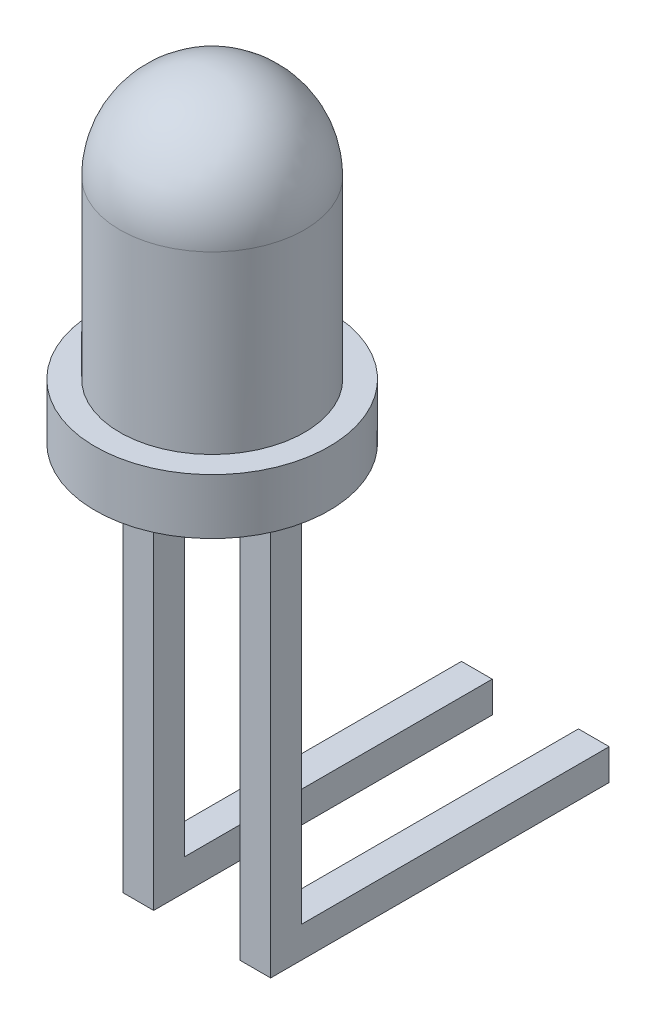
ISO-10303-21;
HEADER;
FILE_DESCRIPTION(('STEP AP214'),'2;1');
FILE_NAME('part.step','',(''),(''),'','','');
FILE_SCHEMA(('AUTOMOTIVE_DESIGN { 1 0 10303 214 1 1 1 1 }'));
ENDSEC;
DATA;
#1=APPLICATION_CONTEXT('core data for automotive mechanical design processes');
#2=APPLICATION_PROTOCOL_DEFINITION('international standard','automotive_design',2000,#1);
#3=PRODUCT_CONTEXT('',#1,'mechanical');
#4=PRODUCT('Part','Part','',(#3));
#5=PRODUCT_RELATED_PRODUCT_CATEGORY('part','',(#4));
#6=PRODUCT_DEFINITION_FORMATION('','',#4);
#7=PRODUCT_DEFINITION_CONTEXT('part definition',#1,'design');
#8=PRODUCT_DEFINITION('design','',#6,#7);
#9=PRODUCT_DEFINITION_SHAPE('','',#8);
#10=(LENGTH_UNIT() NAMED_UNIT(*) SI_UNIT(.MILLI.,.METRE.));
#11=(NAMED_UNIT(*) PLANE_ANGLE_UNIT() SI_UNIT($,.RADIAN.));
#12=(NAMED_UNIT(*) SI_UNIT($,.STERADIAN.) SOLID_ANGLE_UNIT());
#13=UNCERTAINTY_MEASURE_WITH_UNIT(LENGTH_MEASURE(1.E-05),#10,'distance_accuracy_value','');
#14=(GEOMETRIC_REPRESENTATION_CONTEXT(3) GLOBAL_UNCERTAINTY_ASSIGNED_CONTEXT((#13)) GLOBAL_UNIT_ASSIGNED_CONTEXT((#10,
#11,#12)) REPRESENTATION_CONTEXT('',''));
#15=CARTESIAN_POINT('',(0.,0.,0.));
#16=DIRECTION('',(0.,0.,1.));
#17=DIRECTION('',(1.,0.,0.));
#18=AXIS2_PLACEMENT_3D('',#15,#16,#17);
#19=CARTESIAN_POINT('',(0.,0.,-0.25));
#20=DIRECTION('',(0.,0.,-1.));
#21=DIRECTION('',(-1.,0.,0.));
#22=AXIS2_PLACEMENT_3D('',#19,#20,#21);
#23=PLANE('',#22);
#24=DIRECTION('',(0.,1.,0.));
#25=VECTOR('',#24,1.);
#26=CARTESIAN_POINT('',(1.2,2.31652278103782,-0.25));
#27=LINE('',#26,#25);
#28=CARTESIAN_POINT('',(1.2,-3.97867943829056,-0.25));
#29=VERTEX_POINT('',#28);
#30=CARTESIAN_POINT('',(1.2,2.31652278103782,-0.25));
#31=VERTEX_POINT('',#30);
#32=EDGE_CURVE('E171',#29,#31,#27,.T.);
#33=ORIENTED_EDGE('',*,*,#32,.F.);
#34=DIRECTION('',(1.,0.,0.));
#35=VECTOR('',#34,1.);
#36=CARTESIAN_POINT('',(0.700000000000002,-3.97867943829056,-0.25));
#37=LINE('',#36,#35);
#38=CARTESIAN_POINT('',(0.700000000000002,-3.97867943829056,-0.25));
#39=VERTEX_POINT('',#38);
#40=EDGE_CURVE('E143',#39,#29,#37,.T.);
#41=ORIENTED_EDGE('',*,*,#40,.F.);
#42=DIRECTION('',(0.,-1.,0.));
#43=VECTOR('',#42,1.);
#44=CARTESIAN_POINT('',(0.700000000000002,-4.48347721896218,-0.25));
#45=LINE('',#44,#43);
#46=CARTESIAN_POINT('',(0.700000000000001,2.31652278103782,-0.25));
#47=VERTEX_POINT('',#46);
#48=EDGE_CURVE('E148',#47,#39,#45,.T.);
#49=ORIENTED_EDGE('',*,*,#48,.F.);
#50=DIRECTION('',(-1.,0.,0.));
#51=VECTOR('',#50,1.);
#52=CARTESIAN_POINT('',(0.700000000000001,2.31652278103782,-0.25));
#53=LINE('',#52,#51);
#54=EDGE_CURVE('E181',#31,#47,#53,.T.);
#55=ORIENTED_EDGE('',*,*,#54,.F.);
#56=EDGE_LOOP('',(#33,#41,#49,#55));
#57=FACE_BOUND('',#56,.T.);
#58=ADVANCED_FACE('F35',(#57),#23,.T.);
#59=CARTESIAN_POINT('',(0.,0.,-0.25));
#60=DIRECTION('',(0.,0.,-1.));
#61=DIRECTION('',(-1.,0.,0.));
#62=AXIS2_PLACEMENT_3D('',#59,#60,#61);
#63=PLANE('',#62);
#64=DIRECTION('',(0.,1.,0.));
#65=VECTOR('',#64,1.);
#66=CARTESIAN_POINT('',(-0.699999999999999,2.31652278103782,-0.25));
#67=LINE('',#66,#65);
#68=CARTESIAN_POINT('',(-0.699999999999999,-3.97867943829056,-0.25));
#69=VERTEX_POINT('',#68);
#70=CARTESIAN_POINT('',(-0.699999999999999,2.31652278103782,-0.25));
#71=VERTEX_POINT('',#70);
#72=EDGE_CURVE('E195',#69,#71,#67,.T.);
#73=ORIENTED_EDGE('',*,*,#72,.F.);
#74=DIRECTION('',(1.,0.,0.));
#75=VECTOR('',#74,1.);
#76=CARTESIAN_POINT('',(-1.2,-3.97867943829056,-0.25));
#77=LINE('',#76,#75);
#78=CARTESIAN_POINT('',(-1.2,-3.97867943829056,-0.25));
#79=VERTEX_POINT('',#78);
#80=EDGE_CURVE('E149',#79,#69,#77,.T.);
#81=ORIENTED_EDGE('',*,*,#80,.F.);
#82=DIRECTION('',(0.,-1.,0.));
#83=VECTOR('',#82,1.);
#84=CARTESIAN_POINT('',(-1.2,-4.48347721896218,-0.25));
#85=LINE('',#84,#83);
#86=CARTESIAN_POINT('',(-1.2,2.31652278103782,-0.25));
#87=VERTEX_POINT('',#86);
#88=EDGE_CURVE('E204',#87,#79,#85,.T.);
#89=ORIENTED_EDGE('',*,*,#88,.F.);
#90=DIRECTION('',(-1.,0.,0.));
#91=VECTOR('',#90,1.);
#92=CARTESIAN_POINT('',(-0.699999999999999,2.31652278103782,-0.25));
#93=LINE('',#92,#91);
#94=EDGE_CURVE('E190',#71,#87,#93,.T.);
#95=ORIENTED_EDGE('',*,*,#94,.F.);
#96=EDGE_LOOP('',(#73,#81,#89,#95));
#97=FACE_BOUND('',#96,.T.);
#98=ADVANCED_FACE('F231',(#97),#63,.T.);
#99=CARTESIAN_POINT('',(-1.9,2.31652278103782,0.));
#100=DIRECTION('',(0.,-1.,0.));
#101=DIRECTION('',(1.,0.,0.));
#102=AXIS2_PLACEMENT_3D('',#99,#100,#101);
#103=PLANE('',#102);
#104=CARTESIAN_POINT('',(0.,2.31652278103782,0.));
#105=DIRECTION('',(0.,1.,0.));
#106=DIRECTION('',(-1.,0.,0.));
#107=AXIS2_PLACEMENT_3D('',#104,#105,#106);
#108=CIRCLE('',#107,1.9);
#109=CARTESIAN_POINT('',(-1.9,2.31652278103782,0.));
#110=VERTEX_POINT('',#109);
#111=EDGE_CURVE('E43',#110,#110,#108,.T.);
#112=ORIENTED_EDGE('',*,*,#111,.F.);
#113=EDGE_LOOP('',(#112));
#114=FACE_BOUND('',#113,.T.);
#115=DIRECTION('',(0.,0.,-1.));
#116=VECTOR('',#115,1.);
#117=CARTESIAN_POINT('',(-1.2,2.31652278103782,0.25));
#118=LINE('',#117,#116);
#119=CARTESIAN_POINT('',(-1.2,2.31652278103782,0.25));
#120=VERTEX_POINT('',#119);
#121=EDGE_CURVE('E214',#120,#87,#118,.T.);
#122=ORIENTED_EDGE('',*,*,#121,.F.);
#123=DIRECTION('',(-1.,0.,0.));
#124=VECTOR('',#123,1.);
#125=CARTESIAN_POINT('',(-0.699999999999999,2.31652278103782,0.25));
#126=LINE('',#125,#124);
#127=CARTESIAN_POINT('',(-0.699999999999999,2.31652278103782,0.25));
#128=VERTEX_POINT('',#127);
#129=EDGE_CURVE('E191',#128,#120,#126,.T.);
#130=ORIENTED_EDGE('',*,*,#129,.F.);
#131=DIRECTION('',(0.,0.,-1.));
#132=VECTOR('',#131,1.);
#133=CARTESIAN_POINT('',(-0.699999999999999,2.31652278103782,0.25));
#134=LINE('',#133,#132);
#135=EDGE_CURVE('E202',#128,#71,#134,.T.);
#136=ORIENTED_EDGE('',*,*,#135,.T.);
#137=ORIENTED_EDGE('',*,*,#94,.T.);
#138=EDGE_LOOP('',(#122,#130,#136,#137));
#139=FACE_BOUND('',#138,.T.);
#140=DIRECTION('',(0.,0.,-1.));
#141=VECTOR('',#140,1.);
#142=CARTESIAN_POINT('',(0.700000000000001,2.31652278103782,0.25));
#143=LINE('',#142,#141);
#144=CARTESIAN_POINT('',(0.700000000000001,2.31652278103782,0.25));
#145=VERTEX_POINT('',#144);
#146=EDGE_CURVE('E55',#145,#47,#143,.T.);
#147=ORIENTED_EDGE('',*,*,#146,.F.);
#148=DIRECTION('',(-1.,0.,0.));
#149=VECTOR('',#148,1.);
#150=CARTESIAN_POINT('',(0.700000000000001,2.31652278103782,0.25));
#151=LINE('',#150,#149);
#152=CARTESIAN_POINT('',(1.2,2.31652278103782,0.25));
#153=VERTEX_POINT('',#152);
#154=EDGE_CURVE('E50',#153,#145,#151,.T.);
#155=ORIENTED_EDGE('',*,*,#154,.F.);
#156=DIRECTION('',(0.,0.,-1.));
#157=VECTOR('',#156,1.);
#158=CARTESIAN_POINT('',(1.2,2.31652278103782,0.25));
#159=LINE('',#158,#157);
#160=EDGE_CURVE('E188',#153,#31,#159,.T.);
#161=ORIENTED_EDGE('',*,*,#160,.T.);
#162=ORIENTED_EDGE('',*,*,#54,.T.);
#163=EDGE_LOOP('',(#147,#155,#161,#162));
#164=FACE_BOUND('',#163,.T.);
#165=ADVANCED_FACE('F228',(#114,#139,#164),#103,.T.);
#166=CARTESIAN_POINT('',(-1.5,3.21652278103782,0.));
#167=DIRECTION('',(0.,1.,0.));
#168=DIRECTION('',(-1.,0.,0.));
#169=AXIS2_PLACEMENT_3D('',#166,#167,#168);
#170=PLANE('',#169);
#171=CARTESIAN_POINT('',(0.,3.21652278103782,0.));
#172=DIRECTION('',(0.,1.,0.));
#173=DIRECTION('',(-1.,0.,0.));
#174=AXIS2_PLACEMENT_3D('',#171,#172,#173);
#175=CIRCLE('',#174,1.9);
#176=CARTESIAN_POINT('',(-1.9,3.21652278103782,0.));
#177=VERTEX_POINT('',#176);
#178=EDGE_CURVE('E11',#177,#177,#175,.T.);
#179=ORIENTED_EDGE('',*,*,#178,.T.);
#180=EDGE_LOOP('',(#179));
#181=FACE_BOUND('',#180,.T.);
#182=CARTESIAN_POINT('',(0.,3.21652278103782,0.));
#183=DIRECTION('',(0.,1.,0.));
#184=DIRECTION('',(-1.,0.,0.));
#185=AXIS2_PLACEMENT_3D('',#182,#183,#184);
#186=CIRCLE('',#185,1.5);
#187=CARTESIAN_POINT('',(-1.5,3.21652278103782,0.));
#188=VERTEX_POINT('',#187);
#189=EDGE_CURVE('E217',#188,#188,#186,.T.);
#190=ORIENTED_EDGE('',*,*,#189,.F.);
#191=EDGE_LOOP('',(#190));
#192=FACE_BOUND('',#191,.T.);
#193=ADVANCED_FACE('F37',(#181,#192),#170,.T.);
#194=CARTESIAN_POINT('',(0.,7.56652278103782,0.));
#195=DIRECTION('',(0.,1.,0.));
#196=DIRECTION('',(-1.,0.,0.));
#197=AXIS2_PLACEMENT_3D('',#194,#195,#196);
#198=CYLINDRICAL_SURFACE('',#197,1.9);
#199=ORIENTED_EDGE('',*,*,#111,.T.);
#200=EDGE_LOOP('',(#199));
#201=FACE_BOUND('',#200,.T.);
#202=ORIENTED_EDGE('',*,*,#178,.F.);
#203=EDGE_LOOP('',(#202));
#204=FACE_BOUND('',#203,.T.);
#205=ADVANCED_FACE('F225',(#201,#204),#198,.T.);
#206=CARTESIAN_POINT('',(0.,6.06652278103782,0.));
#207=DIRECTION('',(0.,1.,0.));
#208=DIRECTION('',(1.,0.,0.));
#209=AXIS2_PLACEMENT_3D('',#206,#207,#208);
#210=SPHERICAL_SURFACE('',#209,1.5);
#211=CARTESIAN_POINT('',(0.,6.06652278103782,0.));
#212=DIRECTION('',(0.,1.,0.));
#213=DIRECTION('',(-1.,0.,0.));
#214=AXIS2_PLACEMENT_3D('',#211,#212,#213);
#215=CIRCLE('',#214,1.5);
#216=CARTESIAN_POINT('',(-1.5,6.06652278103782,0.));
#217=VERTEX_POINT('',#216);
#218=EDGE_CURVE('E220',#217,#217,#215,.T.);
#219=ORIENTED_EDGE('',*,*,#218,.T.);
#220=EDGE_LOOP('',(#219));
#221=FACE_BOUND('',#220,.T.);
#222=ADVANCED_FACE('F412',(#221),#210,.T.);
#223=CARTESIAN_POINT('',(0.,7.56652278103782,0.));
#224=DIRECTION('',(0.,1.,0.));
#225=DIRECTION('',(-1.,0.,0.));
#226=AXIS2_PLACEMENT_3D('',#223,#224,#225);
#227=CYLINDRICAL_SURFACE('',#226,1.5);
#228=ORIENTED_EDGE('',*,*,#189,.T.);
#229=EDGE_LOOP('',(#228));
#230=FACE_BOUND('',#229,.T.);
#231=ORIENTED_EDGE('',*,*,#218,.F.);
#232=EDGE_LOOP('',(#231));
#233=FACE_BOUND('',#232,.T.);
#234=ADVANCED_FACE('F268',(#230,#233),#227,.T.);
#235=CARTESIAN_POINT('',(-1.2,-4.48347721896218,0.25));
#236=DIRECTION('',(1.,0.,0.));
#237=DIRECTION('',(0.,0.,-1.));
#238=AXIS2_PLACEMENT_3D('',#235,#236,#237);
#239=PLANE('',#238);
#240=ORIENTED_EDGE('',*,*,#88,.T.);
#241=DIRECTION('',(0.,0.,1.));
#242=VECTOR('',#241,1.);
#243=CARTESIAN_POINT('',(-1.2,-3.97867943829056,-5.25));
#244=LINE('',#243,#242);
#245=CARTESIAN_POINT('',(-1.2,-3.97867943829056,-5.25));
#246=VERTEX_POINT('',#245);
#247=EDGE_CURVE('E169',#246,#79,#244,.T.);
#248=ORIENTED_EDGE('',*,*,#247,.F.);
#249=DIRECTION('',(0.,1.,0.));
#250=VECTOR('',#249,1.);
#251=CARTESIAN_POINT('',(-1.2,-4.48347721896218,-5.25));
#252=LINE('',#251,#250);
#253=CARTESIAN_POINT('',(-1.2,-4.48347721896218,-5.25));
#254=VERTEX_POINT('',#253);
#255=EDGE_CURVE('E151',#254,#246,#252,.T.);
#256=ORIENTED_EDGE('',*,*,#255,.F.);
#257=DIRECTION('',(0.,0.,-1.));
#258=VECTOR('',#257,1.);
#259=CARTESIAN_POINT('',(-1.2,-4.48347721896218,0.25));
#260=LINE('',#259,#258);
#261=CARTESIAN_POINT('',(-1.2,-4.48347721896218,0.25));
#262=VERTEX_POINT('',#261);
#263=EDGE_CURVE('E212',#262,#254,#260,.T.);
#264=ORIENTED_EDGE('',*,*,#263,.F.);
#265=DIRECTION('',(0.,-1.,0.));
#266=VECTOR('',#265,1.);
#267=CARTESIAN_POINT('',(-1.2,-4.48347721896218,0.25));
#268=LINE('',#267,#266);
#269=EDGE_CURVE('E194',#120,#262,#268,.T.);
#270=ORIENTED_EDGE('',*,*,#269,.F.);
#271=ORIENTED_EDGE('',*,*,#121,.T.);
#272=EDGE_LOOP('',(#240,#248,#256,#264,#270,#271));
#273=FACE_BOUND('',#272,.T.);
#274=ADVANCED_FACE('F238',(#273),#239,.F.);
#275=CARTESIAN_POINT('',(-0.699999999999998,-4.48347721896218,0.25));
#276=DIRECTION('',(0.,1.,0.));
#277=DIRECTION('',(0.,0.,1.));
#278=AXIS2_PLACEMENT_3D('',#275,#276,#277);
#279=PLANE('',#278);
#280=ORIENTED_EDGE('',*,*,#263,.T.);
#281=DIRECTION('',(-1.,0.,0.));
#282=VECTOR('',#281,1.);
#283=CARTESIAN_POINT('',(-1.2,-4.48347721896218,-5.25));
#284=LINE('',#283,#282);
#285=CARTESIAN_POINT('',(-0.699999999999999,-4.48347721896218,-5.25));
#286=VERTEX_POINT('',#285);
#287=EDGE_CURVE('E163',#286,#254,#284,.T.);
#288=ORIENTED_EDGE('',*,*,#287,.F.);
#289=DIRECTION('',(0.,0.,-1.));
#290=VECTOR('',#289,1.);
#291=CARTESIAN_POINT('',(-0.699999999999998,-4.48347721896218,0.25));
#292=LINE('',#291,#290);
#293=CARTESIAN_POINT('',(-0.699999999999998,-4.48347721896218,0.25));
#294=VERTEX_POINT('',#293);
#295=EDGE_CURVE('E210',#294,#286,#292,.T.);
#296=ORIENTED_EDGE('',*,*,#295,.F.);
#297=DIRECTION('',(1.,0.,0.));
#298=VECTOR('',#297,1.);
#299=CARTESIAN_POINT('',(-0.699999999999998,-4.48347721896218,0.25));
#300=LINE('',#299,#298);
#301=EDGE_CURVE('E197',#262,#294,#300,.T.);
#302=ORIENTED_EDGE('',*,*,#301,.F.);
#303=EDGE_LOOP('',(#280,#288,#296,#302));
#304=FACE_BOUND('',#303,.T.);
#305=ADVANCED_FACE('F260',(#304),#279,.F.);
#306=CARTESIAN_POINT('',(-0.699999999999999,2.31652278103782,0.25));
#307=DIRECTION('',(-1.,0.,0.));
#308=DIRECTION('',(0.,-1.,0.));
#309=AXIS2_PLACEMENT_3D('',#306,#307,#308);
#310=PLANE('',#309);
#311=ORIENTED_EDGE('',*,*,#295,.T.);
#312=DIRECTION('',(0.,-1.,0.));
#313=VECTOR('',#312,1.);
#314=CARTESIAN_POINT('',(-0.699999999999999,-4.48347721896218,-5.25));
#315=LINE('',#314,#313);
#316=CARTESIAN_POINT('',(-0.699999999999999,-3.97867943829056,-5.25));
#317=VERTEX_POINT('',#316);
#318=EDGE_CURVE('E160',#317,#286,#315,.T.);
#319=ORIENTED_EDGE('',*,*,#318,.F.);
#320=DIRECTION('',(0.,0.,1.));
#321=VECTOR('',#320,1.);
#322=CARTESIAN_POINT('',(-0.699999999999999,-3.97867943829056,-5.25));
#323=LINE('',#322,#321);
#324=EDGE_CURVE('E165',#317,#69,#323,.T.);
#325=ORIENTED_EDGE('',*,*,#324,.T.);
#326=ORIENTED_EDGE('',*,*,#72,.T.);
#327=ORIENTED_EDGE('',*,*,#135,.F.);
#328=DIRECTION('',(0.,1.,0.));
#329=VECTOR('',#328,1.);
#330=CARTESIAN_POINT('',(-0.699999999999999,2.31652278103782,0.25));
#331=LINE('',#330,#329);
#332=EDGE_CURVE('E199',#294,#128,#331,.T.);
#333=ORIENTED_EDGE('',*,*,#332,.F.);
#334=EDGE_LOOP('',(#311,#319,#325,#326,#327,#333));
#335=FACE_BOUND('',#334,.T.);
#336=ADVANCED_FACE('F247',(#335),#310,.F.);
#337=CARTESIAN_POINT('',(0.,0.,0.25));
#338=DIRECTION('',(0.,0.,-1.));
#339=DIRECTION('',(-1.,0.,0.));
#340=AXIS2_PLACEMENT_3D('',#337,#338,#339);
#341=PLANE('',#340);
#342=ORIENTED_EDGE('',*,*,#129,.T.);
#343=ORIENTED_EDGE('',*,*,#269,.T.);
#344=ORIENTED_EDGE('',*,*,#301,.T.);
#345=ORIENTED_EDGE('',*,*,#332,.T.);
#346=EDGE_LOOP('',(#342,#343,#344,#345));
#347=FACE_BOUND('',#346,.T.);
#348=ADVANCED_FACE('F242',(#347),#341,.F.);
#349=CARTESIAN_POINT('',(1.2,2.31652278103782,0.25));
#350=DIRECTION('',(-1.,0.,0.));
#351=DIRECTION('',(0.,-1.,0.));
#352=AXIS2_PLACEMENT_3D('',#349,#350,#351);
#353=PLANE('',#352);
#354=DIRECTION('',(0.,0.,-1.));
#355=VECTOR('',#354,1.);
#356=CARTESIAN_POINT('',(1.2,-4.48347721896218,0.25));
#357=LINE('',#356,#355);
#358=CARTESIAN_POINT('',(1.2,-4.48347721896218,0.25));
#359=VERTEX_POINT('',#358);
#360=CARTESIAN_POINT('',(1.2,-4.48347721896218,-5.25));
#361=VERTEX_POINT('',#360);
#362=EDGE_CURVE('E179',#359,#361,#357,.T.);
#363=ORIENTED_EDGE('',*,*,#362,.T.);
#364=DIRECTION('',(0.,-1.,0.));
#365=VECTOR('',#364,1.);
#366=CARTESIAN_POINT('',(1.2,-4.48347721896218,-5.25));
#367=LINE('',#366,#365);
#368=CARTESIAN_POINT('',(1.2,-3.97867943829056,-5.25));
#369=VERTEX_POINT('',#368);
#370=EDGE_CURVE('E133',#369,#361,#367,.T.);
#371=ORIENTED_EDGE('',*,*,#370,.F.);
#372=DIRECTION('',(0.,0.,1.));
#373=VECTOR('',#372,1.);
#374=CARTESIAN_POINT('',(1.2,-3.97867943829056,-5.25));
#375=LINE('',#374,#373);
#376=EDGE_CURVE('E129',#369,#29,#375,.T.);
#377=ORIENTED_EDGE('',*,*,#376,.T.);
#378=ORIENTED_EDGE('',*,*,#32,.T.);
#379=ORIENTED_EDGE('',*,*,#160,.F.);
#380=DIRECTION('',(0.,1.,0.));
#381=VECTOR('',#380,1.);
#382=CARTESIAN_POINT('',(1.2,2.31652278103782,0.25));
#383=LINE('',#382,#381);
#384=EDGE_CURVE('E172',#359,#153,#383,.T.);
#385=ORIENTED_EDGE('',*,*,#384,.F.);
#386=EDGE_LOOP('',(#363,#371,#377,#378,#379,#385));
#387=FACE_BOUND('',#386,.T.);
#388=ADVANCED_FACE('F288',(#387),#353,.F.);
#389=CARTESIAN_POINT('',(0.700000000000002,-4.48347721896218,0.25));
#390=DIRECTION('',(1.,0.,0.));
#391=DIRECTION('',(0.,1.,0.));
#392=AXIS2_PLACEMENT_3D('',#389,#390,#391);
#393=PLANE('',#392);
#394=ORIENTED_EDGE('',*,*,#48,.T.);
#395=DIRECTION('',(0.,0.,1.));
#396=VECTOR('',#395,1.);
#397=CARTESIAN_POINT('',(0.700000000000002,-3.97867943829056,-5.25));
#398=LINE('',#397,#396);
#399=CARTESIAN_POINT('',(0.700000000000002,-3.97867943829056,-5.25));
#400=VERTEX_POINT('',#399);
#401=EDGE_CURVE('E126',#400,#39,#398,.T.);
#402=ORIENTED_EDGE('',*,*,#401,.F.);
#403=DIRECTION('',(0.,1.,0.));
#404=VECTOR('',#403,1.);
#405=CARTESIAN_POINT('',(0.700000000000002,-4.48347721896218,-5.25));
#406=LINE('',#405,#404);
#407=CARTESIAN_POINT('',(0.700000000000002,-4.48347721896218,-5.25));
#408=VERTEX_POINT('',#407);
#409=EDGE_CURVE('E134',#408,#400,#406,.T.);
#410=ORIENTED_EDGE('',*,*,#409,.F.);
#411=DIRECTION('',(0.,0.,-1.));
#412=VECTOR('',#411,1.);
#413=CARTESIAN_POINT('',(0.700000000000002,-4.48347721896218,0.25));
#414=LINE('',#413,#412);
#415=CARTESIAN_POINT('',(0.700000000000002,-4.48347721896218,0.25));
#416=VERTEX_POINT('',#415);
#417=EDGE_CURVE('E185',#416,#408,#414,.T.);
#418=ORIENTED_EDGE('',*,*,#417,.F.);
#419=DIRECTION('',(0.,-1.,0.));
#420=VECTOR('',#419,1.);
#421=CARTESIAN_POINT('',(0.700000000000002,-4.48347721896218,0.25));
#422=LINE('',#421,#420);
#423=EDGE_CURVE('E175',#145,#416,#422,.T.);
#424=ORIENTED_EDGE('',*,*,#423,.F.);
#425=ORIENTED_EDGE('',*,*,#146,.T.);
#426=EDGE_LOOP('',(#394,#402,#410,#418,#424,#425));
#427=FACE_BOUND('',#426,.T.);
#428=ADVANCED_FACE('F146',(#427),#393,.F.);
#429=CARTESIAN_POINT('',(1.2,-4.48347721896218,0.25));
#430=DIRECTION('',(0.,1.,0.));
#431=DIRECTION('',(0.,0.,1.));
#432=AXIS2_PLACEMENT_3D('',#429,#430,#431);
#433=PLANE('',#432);
#434=ORIENTED_EDGE('',*,*,#417,.T.);
#435=DIRECTION('',(-1.,0.,0.));
#436=VECTOR('',#435,1.);
#437=CARTESIAN_POINT('',(0.700000000000002,-4.48347721896218,-5.25));
#438=LINE('',#437,#436);
#439=EDGE_CURVE('E140',#361,#408,#438,.T.);
#440=ORIENTED_EDGE('',*,*,#439,.F.);
#441=ORIENTED_EDGE('',*,*,#362,.F.);
#442=DIRECTION('',(1.,0.,0.));
#443=VECTOR('',#442,1.);
#444=CARTESIAN_POINT('',(1.2,-4.48347721896218,0.25));
#445=LINE('',#444,#443);
#446=EDGE_CURVE('E177',#416,#359,#445,.T.);
#447=ORIENTED_EDGE('',*,*,#446,.F.);
#448=EDGE_LOOP('',(#434,#440,#441,#447));
#449=FACE_BOUND('',#448,.T.);
#450=ADVANCED_FACE('F282',(#449),#433,.F.);
#451=CARTESIAN_POINT('',(0.,0.,0.25));
#452=DIRECTION('',(0.,0.,-1.));
#453=DIRECTION('',(-1.,0.,0.));
#454=AXIS2_PLACEMENT_3D('',#451,#452,#453);
#455=PLANE('',#454);
#456=ORIENTED_EDGE('',*,*,#384,.T.);
#457=ORIENTED_EDGE('',*,*,#154,.T.);
#458=ORIENTED_EDGE('',*,*,#423,.T.);
#459=ORIENTED_EDGE('',*,*,#446,.T.);
#460=EDGE_LOOP('',(#456,#457,#458,#459));
#461=FACE_BOUND('',#460,.T.);
#462=ADVANCED_FACE('F280',(#461),#455,.F.);
#463=CARTESIAN_POINT('',(-1.2,-3.97867943829056,-5.25));
#464=DIRECTION('',(0.,-1.,0.));
#465=DIRECTION('',(0.,0.,-1.));
#466=AXIS2_PLACEMENT_3D('',#463,#464,#465);
#467=PLANE('',#466);
#468=ORIENTED_EDGE('',*,*,#80,.T.);
#469=ORIENTED_EDGE('',*,*,#324,.F.);
#470=DIRECTION('',(1.,0.,0.));
#471=VECTOR('',#470,1.);
#472=CARTESIAN_POINT('',(-1.2,-3.97867943829056,-5.25));
#473=LINE('',#472,#471);
#474=EDGE_CURVE('E158',#246,#317,#473,.T.);
#475=ORIENTED_EDGE('',*,*,#474,.F.);
#476=ORIENTED_EDGE('',*,*,#247,.T.);
#477=EDGE_LOOP('',(#468,#469,#475,#476));
#478=FACE_BOUND('',#477,.T.);
#479=ADVANCED_FACE('F253',(#478),#467,.F.);
#480=CARTESIAN_POINT('',(0.,0.,-5.25));
#481=DIRECTION('',(0.,0.,-1.));
#482=DIRECTION('',(-1.,0.,0.));
#483=AXIS2_PLACEMENT_3D('',#480,#481,#482);
#484=PLANE('',#483);
#485=ORIENTED_EDGE('',*,*,#255,.T.);
#486=ORIENTED_EDGE('',*,*,#474,.T.);
#487=ORIENTED_EDGE('',*,*,#318,.T.);
#488=ORIENTED_EDGE('',*,*,#287,.T.);
#489=EDGE_LOOP('',(#485,#486,#487,#488));
#490=FACE_BOUND('',#489,.T.);
#491=ADVANCED_FACE('F257',(#490),#484,.T.);
#492=CARTESIAN_POINT('',(0.700000000000002,-3.97867943829056,-5.25));
#493=DIRECTION('',(0.,-1.,0.));
#494=DIRECTION('',(0.,0.,-1.));
#495=AXIS2_PLACEMENT_3D('',#492,#493,#494);
#496=PLANE('',#495);
#497=ORIENTED_EDGE('',*,*,#40,.T.);
#498=ORIENTED_EDGE('',*,*,#376,.F.);
#499=DIRECTION('',(1.,0.,0.));
#500=VECTOR('',#499,1.);
#501=CARTESIAN_POINT('',(0.700000000000002,-3.97867943829056,-5.25));
#502=LINE('',#501,#500);
#503=EDGE_CURVE('E122',#400,#369,#502,.T.);
#504=ORIENTED_EDGE('',*,*,#503,.F.);
#505=ORIENTED_EDGE('',*,*,#401,.T.);
#506=EDGE_LOOP('',(#497,#498,#504,#505));
#507=FACE_BOUND('',#506,.T.);
#508=ADVANCED_FACE('F124',(#507),#496,.F.);
#509=CARTESIAN_POINT('',(0.,0.,-5.25));
#510=DIRECTION('',(0.,0.,-1.));
#511=DIRECTION('',(-1.,0.,0.));
#512=AXIS2_PLACEMENT_3D('',#509,#510,#511);
#513=PLANE('',#512);
#514=ORIENTED_EDGE('',*,*,#409,.T.);
#515=ORIENTED_EDGE('',*,*,#503,.T.);
#516=ORIENTED_EDGE('',*,*,#370,.T.);
#517=ORIENTED_EDGE('',*,*,#439,.T.);
#518=EDGE_LOOP('',(#514,#515,#516,#517));
#519=FACE_BOUND('',#518,.T.);
#520=ADVANCED_FACE('F138',(#519),#513,.T.);
#521=CLOSED_SHELL('',(#58,#98,#165,#193,#205,#222,#234,#274,#305,#336,#348,#388,#428,#450,#462,
#479,#491,#508,#520));
#522=MANIFOLD_SOLID_BREP('B2',#521);
#523=ADVANCED_BREP_SHAPE_REPRESENTATION('',(#18,#522),#14);
#524=SHAPE_DEFINITION_REPRESENTATION(#9,#523);
ENDSEC;
END-ISO-10303-21;
